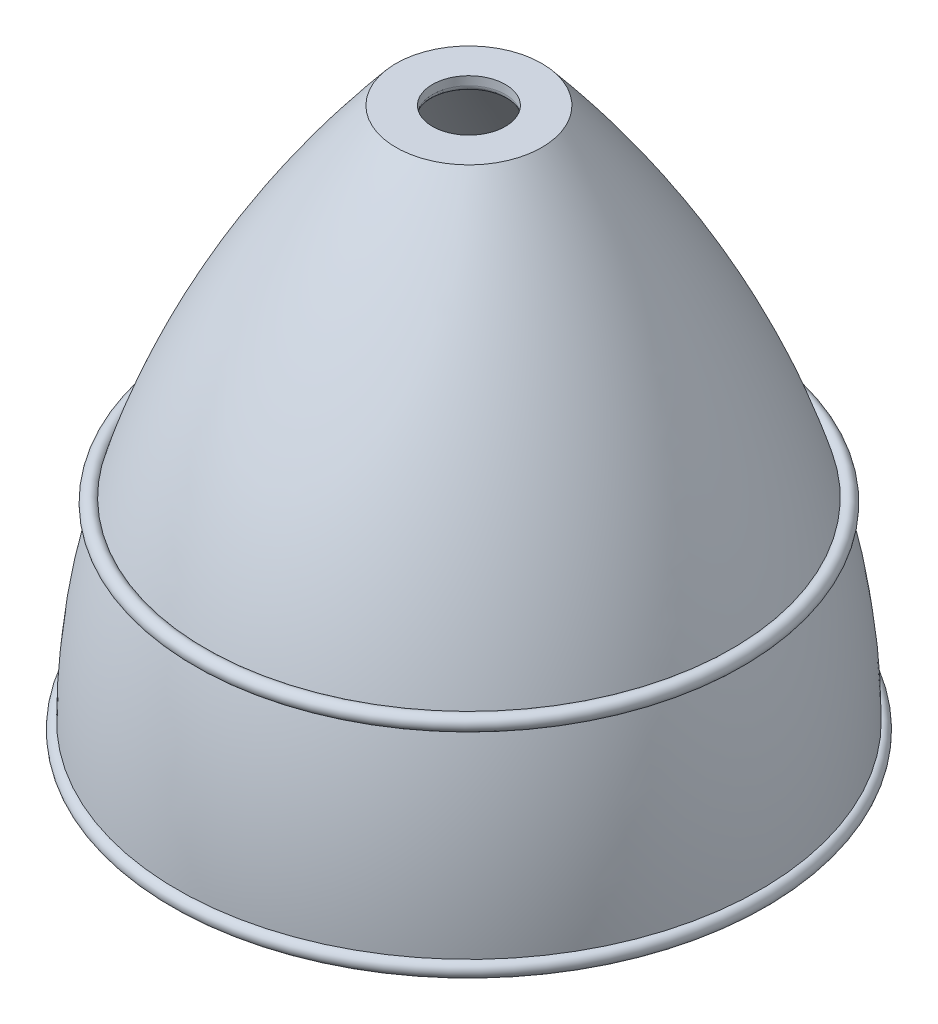
ISO-10303-21;
HEADER;
FILE_DESCRIPTION(('STEP AP214'),'2;1');
FILE_NAME('part.step','',(''),(''),'','','');
FILE_SCHEMA(('AUTOMOTIVE_DESIGN { 1 0 10303 214 1 1 1 1 }'));
ENDSEC;
DATA;
#1=APPLICATION_CONTEXT('core data for automotive mechanical design processes');
#2=APPLICATION_PROTOCOL_DEFINITION('international standard','automotive_design',2000,#1);
#3=PRODUCT_CONTEXT('',#1,'mechanical');
#4=PRODUCT('Part','Part','',(#3));
#5=PRODUCT_RELATED_PRODUCT_CATEGORY('part','',(#4));
#6=PRODUCT_DEFINITION_FORMATION('','',#4);
#7=PRODUCT_DEFINITION_CONTEXT('part definition',#1,'design');
#8=PRODUCT_DEFINITION('design','',#6,#7);
#9=PRODUCT_DEFINITION_SHAPE('','',#8);
#10=(LENGTH_UNIT() NAMED_UNIT(*) SI_UNIT(.MILLI.,.METRE.));
#11=(NAMED_UNIT(*) PLANE_ANGLE_UNIT() SI_UNIT($,.RADIAN.));
#12=(NAMED_UNIT(*) SI_UNIT($,.STERADIAN.) SOLID_ANGLE_UNIT());
#13=UNCERTAINTY_MEASURE_WITH_UNIT(LENGTH_MEASURE(1.E-05),#10,'distance_accuracy_value','');
#14=(GEOMETRIC_REPRESENTATION_CONTEXT(3) GLOBAL_UNCERTAINTY_ASSIGNED_CONTEXT((#13)) GLOBAL_UNIT_ASSIGNED_CONTEXT((#10,
#11,#12)) REPRESENTATION_CONTEXT('',''));
#15=CARTESIAN_POINT('',(0.,0.,0.));
#16=DIRECTION('',(0.,0.,1.));
#17=DIRECTION('',(1.,0.,0.));
#18=AXIS2_PLACEMENT_3D('',#15,#16,#17);
#19=CARTESIAN_POINT('',(0.,700.,0.));
#20=DIRECTION('',(0.,-1.,0.));
#21=DIRECTION('',(0.,0.,-1.));
#22=AXIS2_PLACEMENT_3D('',#19,#20,#21);
#23=TOROIDAL_SURFACE('',#22,920.892991008689,25.);
#24=CARTESIAN_POINT('',(0.,676.656702043729,0.));
#25=DIRECTION('',(0.,-1.,0.));
#26=DIRECTION('',(0.,0.,-1.));
#27=AXIS2_PLACEMENT_3D('',#24,#25,#26);
#28=CIRCLE('',#27,911.943664747748);
#29=CARTESIAN_POINT('',(0.,676.656702043729,-911.943664747748));
#30=VERTEX_POINT('',#29);
#31=EDGE_CURVE('E45',#30,#30,#28,.T.);
#32=ORIENTED_EDGE('',*,*,#31,.F.);
#33=EDGE_LOOP('',(#32));
#34=FACE_BOUND('',#33,.T.);
#35=CARTESIAN_POINT('',(0.,715.034687503881,0.));
#36=DIRECTION('',(0.,-1.,0.));
#37=DIRECTION('',(0.,0.,-1.));
#38=AXIS2_PLACEMENT_3D('',#35,#36,#37);
#39=CIRCLE('',#38,900.919053698768);
#40=CARTESIAN_POINT('',(0.,715.034687503881,-900.919053698768));
#41=VERTEX_POINT('',#40);
#42=EDGE_CURVE('E60',#41,#41,#39,.T.);
#43=ORIENTED_EDGE('',*,*,#42,.T.);
#44=EDGE_LOOP('',(#43));
#45=FACE_BOUND('',#44,.T.);
#46=ADVANCED_FACE('F34',(#34,#45),#23,.T.);
#47=CARTESIAN_POINT('',(-906.697513724333,695.472705514155,0.));
#48=CARTESIAN_POINT('',(-908.446230732138,689.200704357346,0.));
#49=CARTESIAN_POINT('',(-910.194947739943,682.928703200538,0.));
#50=CARTESIAN_POINT('',(-911.943664747748,676.656702043729,0.));
#51=CARTESIAN_POINT('',(-968.431255444657,474.056605735936,0.));
#52=CARTESIAN_POINT('',(-999.666511444797,264.805463889019,0.));
#53=CARTESIAN_POINT('',(-1000.38455177168,49.9977599656131,0.));
#54=CARTESIAN_POINT('',(-1000.4400749176,33.3875515353826,0.));
#55=CARTESIAN_POINT('',(-1000.49559806353,16.7773431051522,0.));
#56=CARTESIAN_POINT('',(-1000.55112120945,0.167134674921694,0.));
#57=B_SPLINE_CURVE_WITH_KNOTS('',3,(#47,#48,#49,#50,#51,#52,#53,#54,#55,#56),.UNSPECIFIED.,.F.,
.F.,(4,3,3,4),(0.65650603226554,0.666099896540956,0.976003829523011,0.999967443612083),.UNSPECIFIED.);
#58=CARTESIAN_POINT('',(0.,0.,0.));
#59=DIRECTION('',(0.,-1.,0.));
#60=AXIS1_PLACEMENT('',#58,#59);
#61=SURFACE_OF_REVOLUTION('',#57,#60);
#62=CARTESIAN_POINT('',(0.,49.9977599656132,0.));
#63=DIRECTION('',(0.,-1.,0.));
#64=DIRECTION('',(0.,0.,-1.));
#65=AXIS2_PLACEMENT_3D('',#62,#63,#64);
#66=CIRCLE('',#65,1000.38455177168);
#67=CARTESIAN_POINT('',(0.,49.9977599656132,-1000.38455177168));
#68=VERTEX_POINT('',#67);
#69=EDGE_CURVE('E49',#68,#68,#66,.T.);
#70=ORIENTED_EDGE('',*,*,#69,.F.);
#71=EDGE_LOOP('',(#70));
#72=FACE_BOUND('',#71,.T.);
#73=ORIENTED_EDGE('',*,*,#31,.T.);
#74=EDGE_LOOP('',(#73));
#75=FACE_BOUND('',#74,.T.);
#76=ADVANCED_FACE('F95',(#72,#75),#61,.T.);
#77=CARTESIAN_POINT('',(0.,24.9978190054198,0.));
#78=DIRECTION('',(0.,-1.,0.));
#79=DIRECTION('',(0.,0.,-1.));
#80=AXIS2_PLACEMENT_3D('',#77,#78,#79);
#81=TOROIDAL_SURFACE('',#80,1000.3302195819,25.0000000000001);
#82=CARTESIAN_POINT('',(0.,-1.20923092215918E-13,0.));
#83=DIRECTION('',(0.,-1.,0.));
#84=DIRECTION('',(0.,0.,-1.));
#85=AXIS2_PLACEMENT_3D('',#82,#83,#84);
#86=CIRCLE('',#85,1000.6604391638);
#87=CARTESIAN_POINT('',(0.,-1.20923092215918E-13,-1000.6604391638));
#88=VERTEX_POINT('',#87);
#89=EDGE_CURVE('E54',#88,#88,#86,.T.);
#90=ORIENTED_EDGE('',*,*,#89,.F.);
#91=EDGE_LOOP('',(#90));
#92=FACE_BOUND('',#91,.T.);
#93=ORIENTED_EDGE('',*,*,#69,.T.);
#94=EDGE_LOOP('',(#93));
#95=FACE_BOUND('',#94,.T.);
#96=ADVANCED_FACE('F92',(#92,#95),#81,.T.);
#97=CARTESIAN_POINT('',(0.,0.,0.));
#98=DIRECTION('',(0.,-1.,0.));
#99=DIRECTION('',(0.,0.,-1.));
#100=AXIS2_PLACEMENT_3D('',#97,#98,#99);
#101=PLANE('',#100);
#102=CARTESIAN_POINT('',(0.,-1.6585582733597E-13,0.));
#103=DIRECTION('',(0.,-1.,0.));
#104=DIRECTION('',(0.,0.,-1.));
#105=AXIS2_PLACEMENT_3D('',#102,#103,#104);
#106=CIRCLE('',#105,950.551400550226);
#107=CARTESIAN_POINT('',(0.,-1.6585582733597E-13,-950.551400550226));
#108=VERTEX_POINT('',#107);
#109=EDGE_CURVE('E63',#108,#108,#106,.T.);
#110=ORIENTED_EDGE('',*,*,#109,.F.);
#111=EDGE_LOOP('',(#110));
#112=FACE_BOUND('',#111,.T.);
#113=ORIENTED_EDGE('',*,*,#89,.T.);
#114=EDGE_LOOP('',(#113));
#115=FACE_BOUND('',#114,.T.);
#116=ADVANCED_FACE('F88',(#112,#115),#101,.T.);
#117=CARTESIAN_POINT('',(0.,1880.,0.));
#118=DIRECTION('',(0.,-1.,0.));
#119=DIRECTION('',(0.,0.,-1.));
#120=AXIS2_PLACEMENT_3D('',#117,#118,#119);
#121=PLANE('',#120);
#122=CARTESIAN_POINT('',(0.,1880.,0.));
#123=DIRECTION('',(0.,1.,0.));
#124=DIRECTION('',(0.,0.,1.));
#125=AXIS2_PLACEMENT_3D('',#122,#123,#124);
#126=CIRCLE('',#125,125.);
#127=CARTESIAN_POINT('',(0.,1880.,125.));
#128=VERTEX_POINT('',#127);
#129=EDGE_CURVE('E135',#128,#128,#126,.T.);
#130=ORIENTED_EDGE('',*,*,#129,.F.);
#131=EDGE_LOOP('',(#130));
#132=FACE_BOUND('',#131,.T.);
#133=CARTESIAN_POINT('',(0.,1880.,0.));
#134=DIRECTION('',(0.,-1.,0.));
#135=DIRECTION('',(0.,0.,-1.));
#136=AXIS2_PLACEMENT_3D('',#133,#134,#135);
#137=CIRCLE('',#136,250.);
#138=CARTESIAN_POINT('',(0.,1880.,-250.));
#139=VERTEX_POINT('',#138);
#140=EDGE_CURVE('E57',#139,#139,#137,.T.);
#141=ORIENTED_EDGE('',*,*,#140,.F.);
#142=EDGE_LOOP('',(#141));
#143=FACE_BOUND('',#142,.T.);
#144=ADVANCED_FACE('F82',(#132,#143),#121,.F.);
#145=CARTESIAN_POINT('',(-250.,1880.,0.));
#146=CARTESIAN_POINT('',(-543.552624561666,1527.54779896853,0.));
#147=CARTESIAN_POINT('',(-776.457754862619,1135.91400004407,0.));
#148=CARTESIAN_POINT('',(-900.919053698768,715.034687503881,0.));
#149=CARTESIAN_POINT('',(-902.773356373449,708.764162913031,0.));
#150=CARTESIAN_POINT('',(-904.627659048131,702.49363832218,0.));
#151=CARTESIAN_POINT('',(-906.481961722812,696.22311373133,0.));
#152=B_SPLINE_CURVE_WITH_KNOTS('',3,(#145,#146,#147,#148,#149,#150,#151),.UNSPECIFIED.,.F.,.F.,
(4,3,4),(0.,0.646490936984084,0.656122765390317),.UNSPECIFIED.);
#153=CARTESIAN_POINT('',(0.,0.,0.));
#154=DIRECTION('',(0.,-1.,0.));
#155=AXIS1_PLACEMENT('',#153,#154);
#156=SURFACE_OF_REVOLUTION('',#152,#155);
#157=ORIENTED_EDGE('',*,*,#42,.F.);
#158=EDGE_LOOP('',(#157));
#159=FACE_BOUND('',#158,.T.);
#160=ORIENTED_EDGE('',*,*,#140,.T.);
#161=EDGE_LOOP('',(#160));
#162=FACE_BOUND('',#161,.T.);
#163=ADVANCED_FACE('F76',(#159,#162),#156,.T.);
#164=CARTESIAN_POINT('',(-906.697513724333,695.472705514155,0.));
#165=CARTESIAN_POINT('',(-908.446230732138,689.200704357346,0.));
#166=CARTESIAN_POINT('',(-910.194947739943,682.928703200538,0.));
#167=CARTESIAN_POINT('',(-968.431255444657,474.056605735936,0.));
#168=CARTESIAN_POINT('',(-999.666511444797,264.805463889019,0.));
#169=CARTESIAN_POINT('',(-1000.4400749176,33.3875515353826,0.));
#170=CARTESIAN_POINT('',(-1000.49559806353,16.7773431051522,0.));
#171=CARTESIAN_POINT('',(-1000.55112120945,0.167134674921694,0.));
#172=B_SPLINE_CURVE_WITH_KNOTS('',3,(#164,#165,#166,#167,#168,#169,#170,#171),.UNSPECIFIED.,.F.,
.F.,(4,2,2,4),(0.65650603226554,0.666099896540956,0.976003829523011,0.999967443612083),.UNSPECIFIED.);
#173=CARTESIAN_POINT('',(0.,0.,0.));
#174=DIRECTION('',(0.,-1.,0.));
#175=AXIS1_PLACEMENT('',#173,#174);
#176=SURFACE_OF_REVOLUTION('',#172,#175);
#177=OFFSET_SURFACE('',#176,-50.,.F.);
#178=ORIENTED_EDGE('',*,*,#109,.T.);
#179=EDGE_LOOP('',(#178));
#180=FACE_BOUND('',#179,.T.);
#181=CARTESIAN_POINT('',(0.,682.044219630975,0.));
#182=DIRECTION('',(0.,-1.,0.));
#183=DIRECTION('',(0.,0.,-1.));
#184=AXIS2_PLACEMENT_3D('',#181,#182,#183);
#185=CIRCLE('',#184,858.534501288594);
#186=CARTESIAN_POINT('',(0.,682.044219630975,-858.534501288594));
#187=VERTEX_POINT('',#186);
#188=EDGE_CURVE('E131',#187,#187,#185,.T.);
#189=ORIENTED_EDGE('',*,*,#188,.F.);
#190=EDGE_LOOP('',(#189));
#191=FACE_BOUND('',#190,.T.);
#192=ADVANCED_FACE('F81',(#180,#191),#177,.F.);
#193=CARTESIAN_POINT('',(0.,1830.,0.));
#194=DIRECTION('',(0.,-1.,0.));
#195=DIRECTION('',(0.,0.,-1.));
#196=AXIS2_PLACEMENT_3D('',#193,#194,#195);
#197=PLANE('',#196);
#198=CARTESIAN_POINT('',(0.,1830.,0.));
#199=DIRECTION('',(0.,-1.,0.));
#200=DIRECTION('',(0.,0.,-1.));
#201=AXIS2_PLACEMENT_3D('',#198,#199,#200);
#202=CIRCLE('',#201,145.);
#203=CARTESIAN_POINT('',(0.,1830.,-145.));
#204=VERTEX_POINT('',#203);
#205=EDGE_CURVE('E10',#204,#204,#202,.F.);
#206=ORIENTED_EDGE('',*,*,#205,.T.);
#207=EDGE_LOOP('',(#206));
#208=FACE_BOUND('',#207,.T.);
#209=CARTESIAN_POINT('',(0.,1830.,0.));
#210=DIRECTION('',(0.,-1.,0.));
#211=DIRECTION('',(0.,0.,-1.));
#212=AXIS2_PLACEMENT_3D('',#209,#210,#211);
#213=CIRCLE('',#212,226.491280255716);
#214=CARTESIAN_POINT('',(0.,1830.,-226.491280255716));
#215=VERTEX_POINT('',#214);
#216=EDGE_CURVE('E129',#215,#215,#213,.T.);
#217=ORIENTED_EDGE('',*,*,#216,.T.);
#218=EDGE_LOOP('',(#217));
#219=FACE_BOUND('',#218,.T.);
#220=ADVANCED_FACE('F117',(#208,#219),#197,.T.);
#221=CARTESIAN_POINT('',(-250.,1880.,0.));
#222=CARTESIAN_POINT('',(-543.552624561666,1527.54779896853,0.));
#223=CARTESIAN_POINT('',(-776.457754862619,1135.91400004407,0.));
#224=CARTESIAN_POINT('',(-902.773356373449,708.764162913031,0.));
#225=CARTESIAN_POINT('',(-904.627659048131,702.49363832218,0.));
#226=CARTESIAN_POINT('',(-906.481961722812,696.22311373133,0.));
#227=B_SPLINE_CURVE_WITH_KNOTS('',3,(#221,#222,#223,#224,#225,#226),.UNSPECIFIED.,.F.,.F.,(4,2,
4),(0.,0.646490936984084,0.656122765390317),.UNSPECIFIED.);
#228=CARTESIAN_POINT('',(0.,0.,0.));
#229=DIRECTION('',(0.,-1.,0.));
#230=AXIS1_PLACEMENT('',#228,#229);
#231=SURFACE_OF_REVOLUTION('',#227,#230);
#232=OFFSET_SURFACE('',#231,-50.,.F.);
#233=ORIENTED_EDGE('',*,*,#188,.T.);
#234=EDGE_LOOP('',(#233));
#235=FACE_BOUND('',#234,.T.);
#236=ORIENTED_EDGE('',*,*,#216,.F.);
#237=EDGE_LOOP('',(#236));
#238=FACE_BOUND('',#237,.T.);
#239=ADVANCED_FACE('F84',(#235,#238),#232,.F.);
#240=CARTESIAN_POINT('',(0.,-2.22044604925031E-13,0.));
#241=DIRECTION('',(0.,1.,0.));
#242=DIRECTION('',(0.,0.,1.));
#243=AXIS2_PLACEMENT_3D('',#240,#241,#242);
#244=CYLINDRICAL_SURFACE('',#243,125.);
#245=CARTESIAN_POINT('',(0.,1850.,0.));
#246=DIRECTION('',(0.,-1.,0.));
#247=DIRECTION('',(0.,0.,-1.));
#248=AXIS2_PLACEMENT_3D('',#245,#246,#247);
#249=CIRCLE('',#248,125.);
#250=CARTESIAN_POINT('',(0.,1850.,-125.));
#251=VERTEX_POINT('',#250);
#252=EDGE_CURVE('E41',#251,#251,#249,.T.);
#253=ORIENTED_EDGE('',*,*,#252,.T.);
#254=EDGE_LOOP('',(#253));
#255=FACE_BOUND('',#254,.T.);
#256=ORIENTED_EDGE('',*,*,#129,.T.);
#257=EDGE_LOOP('',(#256));
#258=FACE_BOUND('',#257,.T.);
#259=ADVANCED_FACE('F123',(#255,#258),#244,.F.);
#260=CARTESIAN_POINT('',(0.,1850.,0.));
#261=DIRECTION('',(0.,-1.,0.));
#262=DIRECTION('',(0.,0.,-1.));
#263=AXIS2_PLACEMENT_3D('',#260,#261,#262);
#264=TOROIDAL_SURFACE('',#263,145.,20.);
#265=ORIENTED_EDGE('',*,*,#205,.F.);
#266=EDGE_LOOP('',(#265));
#267=FACE_BOUND('',#266,.T.);
#268=ORIENTED_EDGE('',*,*,#252,.F.);
#269=EDGE_LOOP('',(#268));
#270=FACE_BOUND('',#269,.T.);
#271=ADVANCED_FACE('F36',(#267,#270),#264,.T.);
#272=CLOSED_SHELL('',(#46,#76,#96,#116,#144,#163,#192,#220,#239,#259,#271));
#273=MANIFOLD_SOLID_BREP('B2',#272);
#274=ADVANCED_BREP_SHAPE_REPRESENTATION('',(#18,#273),#14);
#275=SHAPE_DEFINITION_REPRESENTATION(#9,#274);
ENDSEC;
END-ISO-10303-21;
